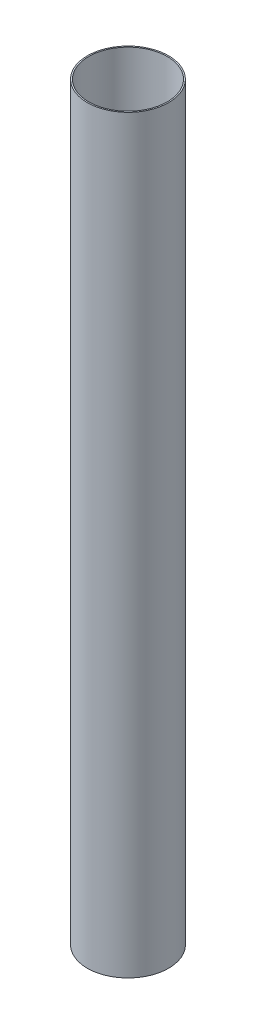
ISO-10303-21;
HEADER;
FILE_DESCRIPTION(('STEP AP214'),'2;1');
FILE_NAME('part.step','',(''),(''),'','','');
FILE_SCHEMA(('AUTOMOTIVE_DESIGN { 1 0 10303 214 1 1 1 1 }'));
ENDSEC;
DATA;
#1=APPLICATION_CONTEXT('core data for automotive mechanical design processes');
#2=APPLICATION_PROTOCOL_DEFINITION('international standard','automotive_design',2000,#1);
#3=PRODUCT_CONTEXT('',#1,'mechanical');
#4=PRODUCT('Part','Part','',(#3));
#5=PRODUCT_RELATED_PRODUCT_CATEGORY('part','',(#4));
#6=PRODUCT_DEFINITION_FORMATION('','',#4);
#7=PRODUCT_DEFINITION_CONTEXT('part definition',#1,'design');
#8=PRODUCT_DEFINITION('design','',#6,#7);
#9=PRODUCT_DEFINITION_SHAPE('','',#8);
#10=(LENGTH_UNIT() NAMED_UNIT(*) SI_UNIT(.MILLI.,.METRE.));
#11=(NAMED_UNIT(*) PLANE_ANGLE_UNIT() SI_UNIT($,.RADIAN.));
#12=(NAMED_UNIT(*) SI_UNIT($,.STERADIAN.) SOLID_ANGLE_UNIT());
#13=UNCERTAINTY_MEASURE_WITH_UNIT(LENGTH_MEASURE(1.E-05),#10,'distance_accuracy_value','');
#14=(GEOMETRIC_REPRESENTATION_CONTEXT(3) GLOBAL_UNCERTAINTY_ASSIGNED_CONTEXT((#13)) GLOBAL_UNIT_ASSIGNED_CONTEXT((#10,
#11,#12)) REPRESENTATION_CONTEXT('',''));
#15=CARTESIAN_POINT('',(0.,0.,0.));
#16=DIRECTION('',(0.,0.,1.));
#17=DIRECTION('',(1.,0.,0.));
#18=AXIS2_PLACEMENT_3D('',#15,#16,#17);
#19=CARTESIAN_POINT('',(0.,14.02,0.));
#20=DIRECTION('',(0.,1.,0.));
#21=DIRECTION('',(0.,0.,1.));
#22=AXIS2_PLACEMENT_3D('',#19,#20,#21);
#23=PLANE('',#22);
#24=CARTESIAN_POINT('',(0.,14.02,0.));
#25=DIRECTION('',(0.,1.,0.));
#26=DIRECTION('',(0.,0.,1.));
#27=AXIS2_PLACEMENT_3D('',#24,#25,#26);
#28=CIRCLE('',#27,0.76);
#29=CARTESIAN_POINT('',(0.,14.02,0.76));
#30=VERTEX_POINT('',#29);
#31=EDGE_CURVE('E10',#30,#30,#28,.T.);
#32=ORIENTED_EDGE('',*,*,#31,.T.);
#33=EDGE_LOOP('',(#32));
#34=FACE_BOUND('',#33,.T.);
#35=CARTESIAN_POINT('',(0.,14.02,0.));
#36=DIRECTION('',(0.,1.,0.));
#37=DIRECTION('',(0.,0.,1.));
#38=AXIS2_PLACEMENT_3D('',#35,#36,#37);
#39=CIRCLE('',#38,0.735);
#40=CARTESIAN_POINT('',(0.,14.02,0.735));
#41=VERTEX_POINT('',#40);
#42=EDGE_CURVE('E43',#41,#41,#39,.T.);
#43=ORIENTED_EDGE('',*,*,#42,.F.);
#44=EDGE_LOOP('',(#43));
#45=FACE_BOUND('',#44,.T.);
#46=ADVANCED_FACE('F32',(#34,#45),#23,.T.);
#47=CARTESIAN_POINT('',(0.,0.,0.));
#48=DIRECTION('',(0.,1.,0.));
#49=DIRECTION('',(0.,0.,1.));
#50=AXIS2_PLACEMENT_3D('',#47,#48,#49);
#51=PLANE('',#50);
#52=CARTESIAN_POINT('',(0.,0.,0.));
#53=DIRECTION('',(0.,1.,0.));
#54=DIRECTION('',(0.,0.,1.));
#55=AXIS2_PLACEMENT_3D('',#52,#53,#54);
#56=CIRCLE('',#55,0.76);
#57=CARTESIAN_POINT('',(0.,0.,0.76));
#58=VERTEX_POINT('',#57);
#59=EDGE_CURVE('E36',#58,#58,#56,.T.);
#60=ORIENTED_EDGE('',*,*,#59,.F.);
#61=EDGE_LOOP('',(#60));
#62=FACE_BOUND('',#61,.T.);
#63=CARTESIAN_POINT('',(0.,0.,0.));
#64=DIRECTION('',(0.,1.,0.));
#65=DIRECTION('',(0.,0.,1.));
#66=AXIS2_PLACEMENT_3D('',#63,#64,#65);
#67=CIRCLE('',#66,0.735);
#68=CARTESIAN_POINT('',(0.,0.,0.735));
#69=VERTEX_POINT('',#68);
#70=EDGE_CURVE('E45',#69,#69,#67,.T.);
#71=ORIENTED_EDGE('',*,*,#70,.T.);
#72=EDGE_LOOP('',(#71));
#73=FACE_BOUND('',#72,.T.);
#74=ADVANCED_FACE('F55',(#62,#73),#51,.F.);
#75=CARTESIAN_POINT('',(0.,14.02,0.));
#76=DIRECTION('',(0.,-1.,0.));
#77=DIRECTION('',(0.,0.,-1.));
#78=AXIS2_PLACEMENT_3D('',#75,#76,#77);
#79=CYLINDRICAL_SURFACE('',#78,0.76);
#80=ORIENTED_EDGE('',*,*,#31,.F.);
#81=EDGE_LOOP('',(#80));
#82=FACE_BOUND('',#81,.T.);
#83=ORIENTED_EDGE('',*,*,#59,.T.);
#84=EDGE_LOOP('',(#83));
#85=FACE_BOUND('',#84,.T.);
#86=ADVANCED_FACE('F34',(#82,#85),#79,.T.);
#87=CARTESIAN_POINT('',(0.,14.02,0.));
#88=DIRECTION('',(0.,-1.,0.));
#89=DIRECTION('',(0.,0.,-1.));
#90=AXIS2_PLACEMENT_3D('',#87,#88,#89);
#91=CYLINDRICAL_SURFACE('',#90,0.735);
#92=ORIENTED_EDGE('',*,*,#42,.T.);
#93=EDGE_LOOP('',(#92));
#94=FACE_BOUND('',#93,.T.);
#95=ORIENTED_EDGE('',*,*,#70,.F.);
#96=EDGE_LOOP('',(#95));
#97=FACE_BOUND('',#96,.T.);
#98=ADVANCED_FACE('F51',(#94,#97),#91,.F.);
#99=CLOSED_SHELL('',(#46,#74,#86,#98));
#100=MANIFOLD_SOLID_BREP('B2',#99);
#101=ADVANCED_BREP_SHAPE_REPRESENTATION('',(#18,#100),#14);
#102=SHAPE_DEFINITION_REPRESENTATION(#9,#101);
ENDSEC;
END-ISO-10303-21;
